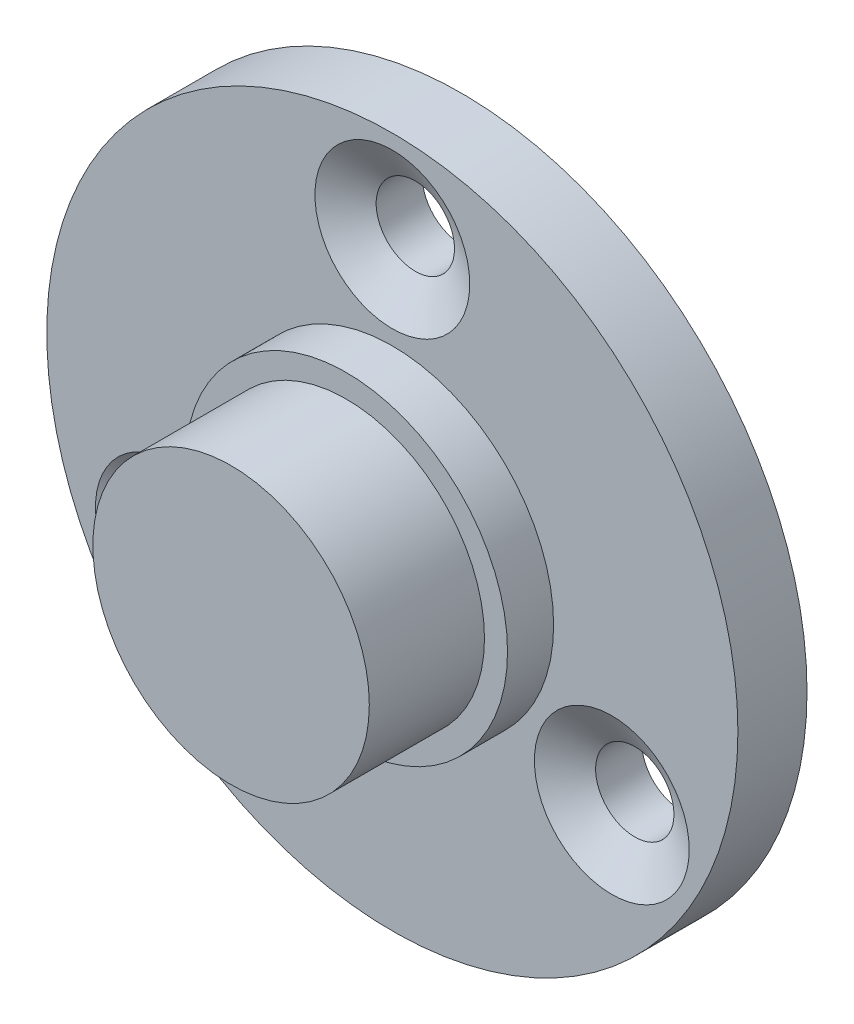
ISO-10303-21;
HEADER;
FILE_DESCRIPTION(('STEP AP214'),'2;1');
FILE_NAME('part.step','',(''),(''),'','','');
FILE_SCHEMA(('AUTOMOTIVE_DESIGN { 1 0 10303 214 1 1 1 1 }'));
ENDSEC;
DATA;
#1=APPLICATION_CONTEXT('core data for automotive mechanical design processes');
#2=APPLICATION_PROTOCOL_DEFINITION('international standard','automotive_design',2000,#1);
#3=PRODUCT_CONTEXT('',#1,'mechanical');
#4=PRODUCT('Part','Part','',(#3));
#5=PRODUCT_RELATED_PRODUCT_CATEGORY('part','',(#4));
#6=PRODUCT_DEFINITION_FORMATION('','',#4);
#7=PRODUCT_DEFINITION_CONTEXT('part definition',#1,'design');
#8=PRODUCT_DEFINITION('design','',#6,#7);
#9=PRODUCT_DEFINITION_SHAPE('','',#8);
#10=(LENGTH_UNIT() NAMED_UNIT(*) SI_UNIT(.MILLI.,.METRE.));
#11=(NAMED_UNIT(*) PLANE_ANGLE_UNIT() SI_UNIT($,.RADIAN.));
#12=(NAMED_UNIT(*) SI_UNIT($,.STERADIAN.) SOLID_ANGLE_UNIT());
#13=UNCERTAINTY_MEASURE_WITH_UNIT(LENGTH_MEASURE(1.E-05),#10,'distance_accuracy_value','');
#14=(GEOMETRIC_REPRESENTATION_CONTEXT(3) GLOBAL_UNCERTAINTY_ASSIGNED_CONTEXT((#13)) GLOBAL_UNIT_ASSIGNED_CONTEXT((#10,
#11,#12)) REPRESENTATION_CONTEXT('',''));
#15=CARTESIAN_POINT('',(0.,0.,0.));
#16=DIRECTION('',(0.,0.,1.));
#17=DIRECTION('',(1.,0.,0.));
#18=AXIS2_PLACEMENT_3D('',#15,#16,#17);
#19=CARTESIAN_POINT('',(0.,0.,3.));
#20=DIRECTION('',(0.,0.,1.));
#21=DIRECTION('',(1.,0.,0.));
#22=AXIS2_PLACEMENT_3D('',#19,#20,#21);
#23=PLANE('',#22);
#24=CARTESIAN_POINT('',(0.,0.,3.));
#25=DIRECTION('',(0.,0.,1.));
#26=DIRECTION('',(1.,0.,0.));
#27=AXIS2_PLACEMENT_3D('',#24,#25,#26);
#28=CIRCLE('',#27,15.);
#29=CARTESIAN_POINT('',(15.,0.,3.));
#30=VERTEX_POINT('',#29);
#31=EDGE_CURVE('E10',#30,#30,#28,.T.);
#32=ORIENTED_EDGE('',*,*,#31,.T.);
#33=EDGE_LOOP('',(#32));
#34=FACE_BOUND('',#33,.T.);
#35=CARTESIAN_POINT('',(9.52627944162946,-5.49999999999963,3.));
#36=DIRECTION('',(0.,0.,1.));
#37=DIRECTION('',(1.,0.,0.));
#38=AXIS2_PLACEMENT_3D('',#35,#36,#37);
#39=CIRCLE('',#38,3.36);
#40=CARTESIAN_POINT('',(12.8862794416295,-5.49999999999963,3.));
#41=VERTEX_POINT('',#40);
#42=EDGE_CURVE('E64',#41,#41,#39,.T.);
#43=ORIENTED_EDGE('',*,*,#42,.F.);
#44=EDGE_LOOP('',(#43));
#45=FACE_BOUND('',#44,.T.);
#46=CARTESIAN_POINT('',(-9.52627944162819,-5.50000000000037,3.));
#47=DIRECTION('',(0.,0.,1.));
#48=DIRECTION('',(1.,0.,0.));
#49=AXIS2_PLACEMENT_3D('',#46,#47,#48);
#50=CIRCLE('',#49,3.36);
#51=CARTESIAN_POINT('',(-6.16627944162819,-5.50000000000037,3.));
#52=VERTEX_POINT('',#51);
#53=EDGE_CURVE('E73',#52,#52,#50,.T.);
#54=ORIENTED_EDGE('',*,*,#53,.F.);
#55=EDGE_LOOP('',(#54));
#56=FACE_BOUND('',#55,.T.);
#57=CARTESIAN_POINT('',(0.,11.,3.));
#58=DIRECTION('',(0.,0.,1.));
#59=DIRECTION('',(1.,0.,0.));
#60=AXIS2_PLACEMENT_3D('',#57,#58,#59);
#61=CIRCLE('',#60,3.36);
#62=CARTESIAN_POINT('',(3.36,11.,3.));
#63=VERTEX_POINT('',#62);
#64=EDGE_CURVE('E103',#63,#63,#61,.T.);
#65=ORIENTED_EDGE('',*,*,#64,.F.);
#66=EDGE_LOOP('',(#65));
#67=FACE_BOUND('',#66,.T.);
#68=CARTESIAN_POINT('',(0.,0.,3.));
#69=DIRECTION('',(0.,0.,1.));
#70=DIRECTION('',(1.,0.,0.));
#71=AXIS2_PLACEMENT_3D('',#68,#69,#70);
#72=CIRCLE('',#71,7.);
#73=CARTESIAN_POINT('',(7.,0.,3.));
#74=VERTEX_POINT('',#73);
#75=EDGE_CURVE('E106',#74,#74,#72,.T.);
#76=ORIENTED_EDGE('',*,*,#75,.F.);
#77=EDGE_LOOP('',(#76));
#78=FACE_BOUND('',#77,.T.);
#79=ADVANCED_FACE('F37',(#34,#45,#56,#67,#78),#23,.T.);
#80=CARTESIAN_POINT('',(0.,0.,3.));
#81=DIRECTION('',(0.,0.,-1.));
#82=DIRECTION('',(-1.,0.,0.));
#83=AXIS2_PLACEMENT_3D('',#80,#81,#82);
#84=CYLINDRICAL_SURFACE('',#83,15.);
#85=ORIENTED_EDGE('',*,*,#31,.F.);
#86=EDGE_LOOP('',(#85));
#87=FACE_BOUND('',#86,.T.);
#88=CARTESIAN_POINT('',(0.,0.,0.));
#89=DIRECTION('',(0.,0.,1.));
#90=DIRECTION('',(1.,0.,0.));
#91=AXIS2_PLACEMENT_3D('',#88,#89,#90);
#92=CIRCLE('',#91,15.);
#93=CARTESIAN_POINT('',(15.,0.,0.));
#94=VERTEX_POINT('',#93);
#95=EDGE_CURVE('E46',#94,#94,#92,.T.);
#96=ORIENTED_EDGE('',*,*,#95,.T.);
#97=EDGE_LOOP('',(#96));
#98=FACE_BOUND('',#97,.T.);
#99=ADVANCED_FACE('F39',(#87,#98),#84,.T.);
#100=CARTESIAN_POINT('',(0.,0.,0.));
#101=DIRECTION('',(0.,0.,1.));
#102=DIRECTION('',(1.,0.,0.));
#103=AXIS2_PLACEMENT_3D('',#100,#101,#102);
#104=PLANE('',#103);
#105=CARTESIAN_POINT('',(0.,11.,0.));
#106=DIRECTION('',(0.,0.,1.));
#107=DIRECTION('',(1.,0.,0.));
#108=AXIS2_PLACEMENT_3D('',#105,#106,#107);
#109=CIRCLE('',#108,1.69999999999999);
#110=CARTESIAN_POINT('',(1.69999999999999,11.,0.));
#111=VERTEX_POINT('',#110);
#112=EDGE_CURVE('E41',#111,#111,#109,.T.);
#113=ORIENTED_EDGE('',*,*,#112,.T.);
#114=EDGE_LOOP('',(#113));
#115=FACE_BOUND('',#114,.T.);
#116=CARTESIAN_POINT('',(-9.52627944162819,-5.50000000000037,0.));
#117=DIRECTION('',(0.,0.,1.));
#118=DIRECTION('',(1.,0.,0.));
#119=AXIS2_PLACEMENT_3D('',#116,#117,#118);
#120=CIRCLE('',#119,1.69999999999999);
#121=CARTESIAN_POINT('',(-7.82627944162819,-5.50000000000037,0.));
#122=VERTEX_POINT('',#121);
#123=EDGE_CURVE('E61',#122,#122,#120,.T.);
#124=ORIENTED_EDGE('',*,*,#123,.T.);
#125=EDGE_LOOP('',(#124));
#126=FACE_BOUND('',#125,.T.);
#127=CARTESIAN_POINT('',(9.52627944162946,-5.49999999999963,0.));
#128=DIRECTION('',(0.,0.,1.));
#129=DIRECTION('',(1.,0.,0.));
#130=AXIS2_PLACEMENT_3D('',#127,#128,#129);
#131=CIRCLE('',#130,1.69999999999999);
#132=CARTESIAN_POINT('',(11.2262794416295,-5.49999999999963,0.));
#133=VERTEX_POINT('',#132);
#134=EDGE_CURVE('E57',#133,#133,#131,.T.);
#135=ORIENTED_EDGE('',*,*,#134,.T.);
#136=EDGE_LOOP('',(#135));
#137=FACE_BOUND('',#136,.T.);
#138=ORIENTED_EDGE('',*,*,#95,.F.);
#139=EDGE_LOOP('',(#138));
#140=FACE_BOUND('',#139,.T.);
#141=ADVANCED_FACE('F129',(#115,#126,#137,#140),#104,.F.);
#142=CARTESIAN_POINT('',(9.52627944162946,-5.49999999999963,3.));
#143=DIRECTION('',(0.,0.,1.));
#144=DIRECTION('',(1.,0.,0.));
#145=AXIS2_PLACEMENT_3D('',#142,#143,#144);
#146=CYLINDRICAL_SURFACE('',#145,1.69999999999999);
#147=CARTESIAN_POINT('',(9.52627944162946,-5.49999999999963,2.00257137241425));
#148=DIRECTION('',(0.,0.,1.));
#149=DIRECTION('',(1.,0.,0.));
#150=AXIS2_PLACEMENT_3D('',#147,#148,#149);
#151=CIRCLE('',#150,1.7);
#152=CARTESIAN_POINT('',(11.2262794416295,-5.49999999999963,2.00257137241425));
#153=VERTEX_POINT('',#152);
#154=EDGE_CURVE('E60',#153,#153,#151,.T.);
#155=ORIENTED_EDGE('',*,*,#154,.T.);
#156=EDGE_LOOP('',(#155));
#157=FACE_BOUND('',#156,.T.);
#158=ORIENTED_EDGE('',*,*,#134,.F.);
#159=EDGE_LOOP('',(#158));
#160=FACE_BOUND('',#159,.T.);
#161=ADVANCED_FACE('F85',(#157,#160),#146,.F.);
#162=CARTESIAN_POINT('',(9.52627944162946,-5.49999999999963,3.));
#163=DIRECTION('',(0.,0.,1.));
#164=DIRECTION('',(1.,0.,0.));
#165=AXIS2_PLACEMENT_3D('',#162,#163,#164);
#166=CONICAL_SURFACE('',#165,3.36,1.02974425867665);
#167=ORIENTED_EDGE('',*,*,#154,.F.);
#168=EDGE_LOOP('',(#167));
#169=FACE_BOUND('',#168,.T.);
#170=ORIENTED_EDGE('',*,*,#42,.T.);
#171=EDGE_LOOP('',(#170));
#172=FACE_BOUND('',#171,.T.);
#173=ADVANCED_FACE('F88',(#169,#172),#166,.F.);
#174=CARTESIAN_POINT('',(-9.52627944162819,-5.50000000000037,3.));
#175=DIRECTION('',(0.,0.,1.));
#176=DIRECTION('',(1.,0.,0.));
#177=AXIS2_PLACEMENT_3D('',#174,#175,#176);
#178=CYLINDRICAL_SURFACE('',#177,1.69999999999999);
#179=CARTESIAN_POINT('',(-9.52627944162819,-5.50000000000037,2.00257137241425));
#180=DIRECTION('',(0.,0.,1.));
#181=DIRECTION('',(1.,0.,0.));
#182=AXIS2_PLACEMENT_3D('',#179,#180,#181);
#183=CIRCLE('',#182,1.7);
#184=CARTESIAN_POINT('',(-7.82627944162819,-5.50000000000037,2.00257137241425));
#185=VERTEX_POINT('',#184);
#186=EDGE_CURVE('E65',#185,#185,#183,.T.);
#187=ORIENTED_EDGE('',*,*,#186,.T.);
#188=EDGE_LOOP('',(#187));
#189=FACE_BOUND('',#188,.T.);
#190=ORIENTED_EDGE('',*,*,#123,.F.);
#191=EDGE_LOOP('',(#190));
#192=FACE_BOUND('',#191,.T.);
#193=ADVANCED_FACE('F91',(#189,#192),#178,.F.);
#194=CARTESIAN_POINT('',(-9.52627944162819,-5.50000000000037,3.));
#195=DIRECTION('',(0.,0.,1.));
#196=DIRECTION('',(1.,0.,0.));
#197=AXIS2_PLACEMENT_3D('',#194,#195,#196);
#198=CONICAL_SURFACE('',#197,3.36,1.02974425867665);
#199=ORIENTED_EDGE('',*,*,#186,.F.);
#200=EDGE_LOOP('',(#199));
#201=FACE_BOUND('',#200,.T.);
#202=ORIENTED_EDGE('',*,*,#53,.T.);
#203=EDGE_LOOP('',(#202));
#204=FACE_BOUND('',#203,.T.);
#205=ADVANCED_FACE('F134',(#201,#204),#198,.F.);
#206=CARTESIAN_POINT('',(0.,11.,3.));
#207=DIRECTION('',(0.,0.,1.));
#208=DIRECTION('',(1.,0.,0.));
#209=AXIS2_PLACEMENT_3D('',#206,#207,#208);
#210=CYLINDRICAL_SURFACE('',#209,1.69999999999999);
#211=CARTESIAN_POINT('',(0.,11.,2.00257137241425));
#212=DIRECTION('',(0.,0.,1.));
#213=DIRECTION('',(1.,0.,0.));
#214=AXIS2_PLACEMENT_3D('',#211,#212,#213);
#215=CIRCLE('',#214,1.7);
#216=CARTESIAN_POINT('',(1.7,11.,2.00257137241425));
#217=VERTEX_POINT('',#216);
#218=EDGE_CURVE('E120',#217,#217,#215,.T.);
#219=ORIENTED_EDGE('',*,*,#218,.T.);
#220=EDGE_LOOP('',(#219));
#221=FACE_BOUND('',#220,.T.);
#222=ORIENTED_EDGE('',*,*,#112,.F.);
#223=EDGE_LOOP('',(#222));
#224=FACE_BOUND('',#223,.T.);
#225=ADVANCED_FACE('F131',(#221,#224),#210,.F.);
#226=CARTESIAN_POINT('',(0.,11.,3.));
#227=DIRECTION('',(0.,0.,1.));
#228=DIRECTION('',(1.,0.,0.));
#229=AXIS2_PLACEMENT_3D('',#226,#227,#228);
#230=CONICAL_SURFACE('',#229,3.36,1.02974425867665);
#231=ORIENTED_EDGE('',*,*,#218,.F.);
#232=EDGE_LOOP('',(#231));
#233=FACE_BOUND('',#232,.T.);
#234=ORIENTED_EDGE('',*,*,#64,.T.);
#235=EDGE_LOOP('',(#234));
#236=FACE_BOUND('',#235,.T.);
#237=ADVANCED_FACE('F133',(#233,#236),#230,.F.);
#238=CARTESIAN_POINT('',(0.,0.,5.));
#239=DIRECTION('',(0.,0.,1.));
#240=DIRECTION('',(1.,0.,0.));
#241=AXIS2_PLACEMENT_3D('',#238,#239,#240);
#242=PLANE('',#241);
#243=CARTESIAN_POINT('',(0.,0.,5.));
#244=DIRECTION('',(0.,0.,1.));
#245=DIRECTION('',(1.,0.,0.));
#246=AXIS2_PLACEMENT_3D('',#243,#244,#245);
#247=CIRCLE('',#246,7.);
#248=CARTESIAN_POINT('',(7.,0.,5.));
#249=VERTEX_POINT('',#248);
#250=EDGE_CURVE('E109',#249,#249,#247,.T.);
#251=ORIENTED_EDGE('',*,*,#250,.T.);
#252=EDGE_LOOP('',(#251));
#253=FACE_BOUND('',#252,.T.);
#254=CARTESIAN_POINT('',(0.,0.,5.));
#255=DIRECTION('',(0.,0.,1.));
#256=DIRECTION('',(1.,0.,0.));
#257=AXIS2_PLACEMENT_3D('',#254,#255,#256);
#258=CIRCLE('',#257,6.);
#259=CARTESIAN_POINT('',(6.,0.,5.));
#260=VERTEX_POINT('',#259);
#261=EDGE_CURVE('E110',#260,#260,#258,.T.);
#262=ORIENTED_EDGE('',*,*,#261,.F.);
#263=EDGE_LOOP('',(#262));
#264=FACE_BOUND('',#263,.T.);
#265=ADVANCED_FACE('F140',(#253,#264),#242,.T.);
#266=CARTESIAN_POINT('',(0.,0.,5.));
#267=DIRECTION('',(0.,0.,-1.));
#268=DIRECTION('',(-1.,0.,0.));
#269=AXIS2_PLACEMENT_3D('',#266,#267,#268);
#270=CYLINDRICAL_SURFACE('',#269,7.);
#271=ORIENTED_EDGE('',*,*,#250,.F.);
#272=EDGE_LOOP('',(#271));
#273=FACE_BOUND('',#272,.T.);
#274=ORIENTED_EDGE('',*,*,#75,.T.);
#275=EDGE_LOOP('',(#274));
#276=FACE_BOUND('',#275,.T.);
#277=ADVANCED_FACE('F155',(#273,#276),#270,.T.);
#278=CARTESIAN_POINT('',(0.,0.,10.));
#279=DIRECTION('',(0.,0.,1.));
#280=DIRECTION('',(1.,0.,0.));
#281=AXIS2_PLACEMENT_3D('',#278,#279,#280);
#282=PLANE('',#281);
#283=CARTESIAN_POINT('',(0.,0.,10.));
#284=DIRECTION('',(0.,0.,1.));
#285=DIRECTION('',(1.,0.,0.));
#286=AXIS2_PLACEMENT_3D('',#283,#284,#285);
#287=CIRCLE('',#286,6.);
#288=CARTESIAN_POINT('',(6.,0.,10.));
#289=VERTEX_POINT('',#288);
#290=EDGE_CURVE('E52',#289,#289,#287,.T.);
#291=ORIENTED_EDGE('',*,*,#290,.T.);
#292=EDGE_LOOP('',(#291));
#293=FACE_BOUND('',#292,.T.);
#294=ADVANCED_FACE('F151',(#293),#282,.T.);
#295=CARTESIAN_POINT('',(0.,0.,10.));
#296=DIRECTION('',(0.,0.,-1.));
#297=DIRECTION('',(-1.,0.,0.));
#298=AXIS2_PLACEMENT_3D('',#295,#296,#297);
#299=CYLINDRICAL_SURFACE('',#298,6.);
#300=ORIENTED_EDGE('',*,*,#261,.T.);
#301=EDGE_LOOP('',(#300));
#302=FACE_BOUND('',#301,.T.);
#303=ORIENTED_EDGE('',*,*,#290,.F.);
#304=EDGE_LOOP('',(#303));
#305=FACE_BOUND('',#304,.T.);
#306=ADVANCED_FACE('F154',(#302,#305),#299,.T.);
#307=CLOSED_SHELL('',(#79,#99,#141,#161,#173,#193,#205,#225,#237,#265,#277,#294,#306));
#308=MANIFOLD_SOLID_BREP('B2',#307);
#309=ADVANCED_BREP_SHAPE_REPRESENTATION('',(#18,#308),#14);
#310=SHAPE_DEFINITION_REPRESENTATION(#9,#309);
ENDSEC;
END-ISO-10303-21;
